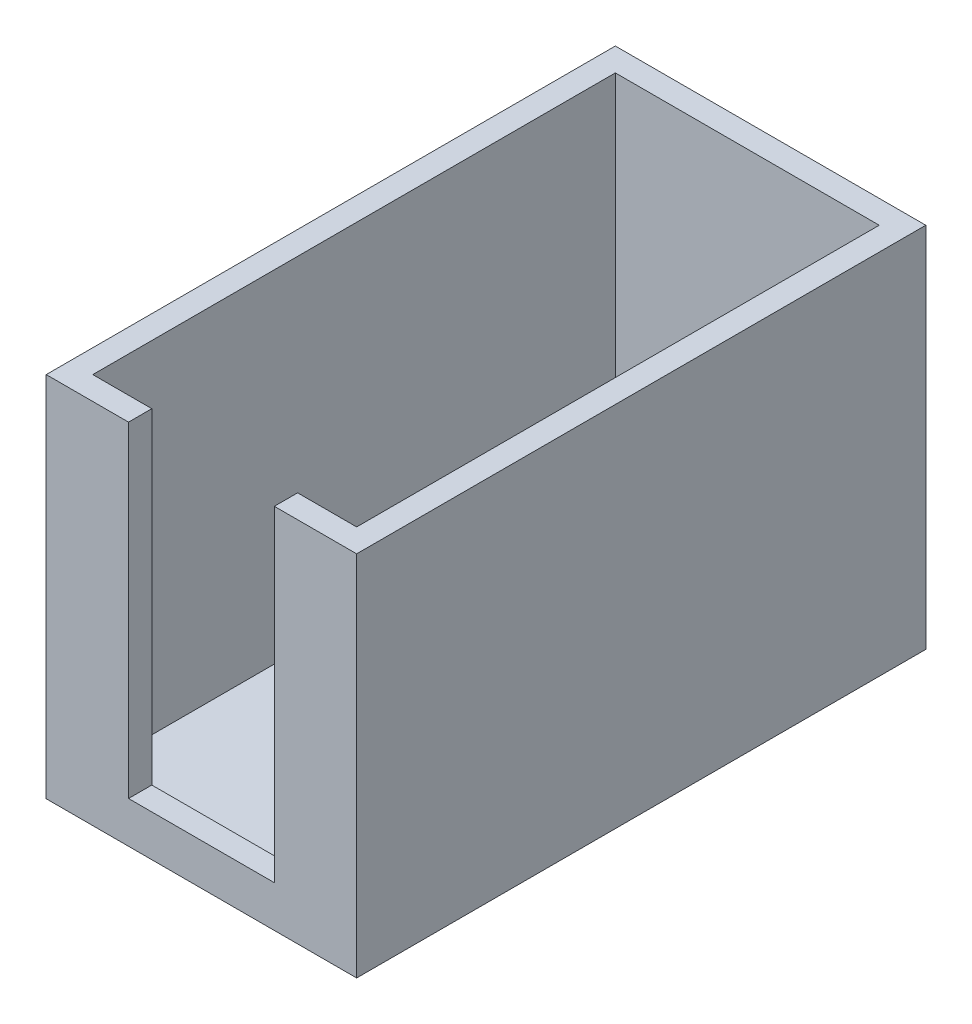
ISO-10303-21;
HEADER;
FILE_DESCRIPTION(('STEP AP214'),'2;1');
FILE_NAME('part.step','',(''),(''),'','','');
FILE_SCHEMA(('AUTOMOTIVE_DESIGN { 1 0 10303 214 1 1 1 1 }'));
ENDSEC;
DATA;
#1=APPLICATION_CONTEXT('core data for automotive mechanical design processes');
#2=APPLICATION_PROTOCOL_DEFINITION('international standard','automotive_design',2000,#1);
#3=PRODUCT_CONTEXT('',#1,'mechanical');
#4=PRODUCT('Part','Part','',(#3));
#5=PRODUCT_RELATED_PRODUCT_CATEGORY('part','',(#4));
#6=PRODUCT_DEFINITION_FORMATION('','',#4);
#7=PRODUCT_DEFINITION_CONTEXT('part definition',#1,'design');
#8=PRODUCT_DEFINITION('design','',#6,#7);
#9=PRODUCT_DEFINITION_SHAPE('','',#8);
#10=(LENGTH_UNIT() NAMED_UNIT(*) SI_UNIT(.MILLI.,.METRE.));
#11=(NAMED_UNIT(*) PLANE_ANGLE_UNIT() SI_UNIT($,.RADIAN.));
#12=(NAMED_UNIT(*) SI_UNIT($,.STERADIAN.) SOLID_ANGLE_UNIT());
#13=UNCERTAINTY_MEASURE_WITH_UNIT(LENGTH_MEASURE(1.E-05),#10,'distance_accuracy_value','');
#14=(GEOMETRIC_REPRESENTATION_CONTEXT(3) GLOBAL_UNCERTAINTY_ASSIGNED_CONTEXT((#13)) GLOBAL_UNIT_ASSIGNED_CONTEXT((#10,
#11,#12)) REPRESENTATION_CONTEXT('',''));
#15=CARTESIAN_POINT('',(0.,0.,0.));
#16=DIRECTION('',(0.,0.,1.));
#17=DIRECTION('',(1.,0.,0.));
#18=AXIS2_PLACEMENT_3D('',#15,#16,#17);
#19=CARTESIAN_POINT('',(0.,28.4,0.));
#20=DIRECTION('',(0.,1.,0.));
#21=DIRECTION('',(0.,0.,1.));
#22=AXIS2_PLACEMENT_3D('',#19,#20,#21);
#23=PLANE('',#22);
#24=DIRECTION('',(0.,0.,-1.));
#25=VECTOR('',#24,1.);
#26=CARTESIAN_POINT('',(5.63628838474872,28.4,34.2811228740046));
#27=LINE('',#26,#25);
#28=CARTESIAN_POINT('',(5.63628838474872,28.4,22.));
#29=VERTEX_POINT('',#28);
#30=CARTESIAN_POINT('',(5.63628838474872,28.4,20.2));
#31=VERTEX_POINT('',#30);
#32=EDGE_CURVE('E254',#29,#31,#27,.T.);
#33=ORIENTED_EDGE('',*,*,#32,.F.);
#34=DIRECTION('',(1.,0.,0.));
#35=VECTOR('',#34,1.);
#36=CARTESIAN_POINT('',(-10.2,28.4,22.));
#37=LINE('',#36,#35);
#38=CARTESIAN_POINT('',(12.,28.4,22.));
#39=VERTEX_POINT('',#38);
#40=EDGE_CURVE('E178',#29,#39,#37,.T.);
#41=ORIENTED_EDGE('',*,*,#40,.T.);
#42=DIRECTION('',(0.,0.,-1.));
#43=VECTOR('',#42,1.);
#44=CARTESIAN_POINT('',(12.,28.4,-20.2));
#45=LINE('',#44,#43);
#46=CARTESIAN_POINT('',(12.,28.4,-22.));
#47=VERTEX_POINT('',#46);
#48=EDGE_CURVE('E213',#39,#47,#45,.T.);
#49=ORIENTED_EDGE('',*,*,#48,.T.);
#50=DIRECTION('',(-1.,0.,0.));
#51=VECTOR('',#50,1.);
#52=CARTESIAN_POINT('',(-10.2,28.4,-22.));
#53=LINE('',#52,#51);
#54=CARTESIAN_POINT('',(-12.,28.4,-22.));
#55=VERTEX_POINT('',#54);
#56=EDGE_CURVE('E216',#47,#55,#53,.T.);
#57=ORIENTED_EDGE('',*,*,#56,.T.);
#58=DIRECTION('',(0.,0.,1.));
#59=VECTOR('',#58,1.);
#60=CARTESIAN_POINT('',(-12.,28.4,-20.2));
#61=LINE('',#60,#59);
#62=CARTESIAN_POINT('',(-12.,28.4,22.));
#63=VERTEX_POINT('',#62);
#64=EDGE_CURVE('E219',#55,#63,#61,.T.);
#65=ORIENTED_EDGE('',*,*,#64,.T.);
#66=CARTESIAN_POINT('',(-5.63628838474872,28.4,22.));
#67=VERTEX_POINT('',#66);
#68=EDGE_CURVE('E221',#63,#67,#37,.T.);
#69=ORIENTED_EDGE('',*,*,#68,.T.);
#70=DIRECTION('',(0.,0.,1.));
#71=VECTOR('',#70,1.);
#72=CARTESIAN_POINT('',(-5.63628838474872,28.4,34.2811228740046));
#73=LINE('',#72,#71);
#74=CARTESIAN_POINT('',(-5.63628838474872,28.4,20.2));
#75=VERTEX_POINT('',#74);
#76=EDGE_CURVE('E248',#75,#67,#73,.T.);
#77=ORIENTED_EDGE('',*,*,#76,.F.);
#78=DIRECTION('',(1.,0.,0.));
#79=VECTOR('',#78,1.);
#80=CARTESIAN_POINT('',(-10.2,28.4,20.2));
#81=LINE('',#80,#79);
#82=CARTESIAN_POINT('',(-10.2,28.4,20.2));
#83=VERTEX_POINT('',#82);
#84=EDGE_CURVE('E200',#83,#75,#81,.T.);
#85=ORIENTED_EDGE('',*,*,#84,.F.);
#86=DIRECTION('',(0.,0.,1.));
#87=VECTOR('',#86,1.);
#88=CARTESIAN_POINT('',(-10.2,28.4,-20.2));
#89=LINE('',#88,#87);
#90=CARTESIAN_POINT('',(-10.2,28.4,-20.2));
#91=VERTEX_POINT('',#90);
#92=EDGE_CURVE('E196',#91,#83,#89,.T.);
#93=ORIENTED_EDGE('',*,*,#92,.F.);
#94=DIRECTION('',(-1.,0.,0.));
#95=VECTOR('',#94,1.);
#96=CARTESIAN_POINT('',(-10.2,28.4,-20.2));
#97=LINE('',#96,#95);
#98=CARTESIAN_POINT('',(10.2,28.4,-20.2));
#99=VERTEX_POINT('',#98);
#100=EDGE_CURVE('E194',#99,#91,#97,.T.);
#101=ORIENTED_EDGE('',*,*,#100,.F.);
#102=DIRECTION('',(0.,0.,-1.));
#103=VECTOR('',#102,1.);
#104=CARTESIAN_POINT('',(10.2,28.4,-20.2));
#105=LINE('',#104,#103);
#106=CARTESIAN_POINT('',(10.2,28.4,20.2));
#107=VERTEX_POINT('',#106);
#108=EDGE_CURVE('E192',#107,#99,#105,.T.);
#109=ORIENTED_EDGE('',*,*,#108,.F.);
#110=EDGE_CURVE('E199',#31,#107,#81,.T.);
#111=ORIENTED_EDGE('',*,*,#110,.F.);
#112=EDGE_LOOP('',(#33,#41,#49,#57,#65,#69,#77,#85,#93,#101,#109,#111));
#113=FACE_BOUND('',#112,.T.);
#114=ADVANCED_FACE('F70',(#113),#23,.T.);
#115=CARTESIAN_POINT('',(0.,0.,0.));
#116=DIRECTION('',(0.,1.,0.));
#117=DIRECTION('',(0.,0.,1.));
#118=AXIS2_PLACEMENT_3D('',#115,#116,#117);
#119=PLANE('',#118);
#120=DIRECTION('',(0.,0.,-1.));
#121=VECTOR('',#120,1.);
#122=CARTESIAN_POINT('',(12.,0.,-20.2));
#123=LINE('',#122,#121);
#124=CARTESIAN_POINT('',(12.,0.,22.));
#125=VERTEX_POINT('',#124);
#126=CARTESIAN_POINT('',(12.,0.,-22.));
#127=VERTEX_POINT('',#126);
#128=EDGE_CURVE('E212',#125,#127,#123,.T.);
#129=ORIENTED_EDGE('',*,*,#128,.F.);
#130=DIRECTION('',(1.,0.,0.));
#131=VECTOR('',#130,1.);
#132=CARTESIAN_POINT('',(-10.2,0.,22.));
#133=LINE('',#132,#131);
#134=CARTESIAN_POINT('',(-12.,0.,22.));
#135=VERTEX_POINT('',#134);
#136=EDGE_CURVE('E217',#135,#125,#133,.T.);
#137=ORIENTED_EDGE('',*,*,#136,.F.);
#138=DIRECTION('',(0.,0.,1.));
#139=VECTOR('',#138,1.);
#140=CARTESIAN_POINT('',(-12.,0.,-20.2));
#141=LINE('',#140,#139);
#142=CARTESIAN_POINT('',(-12.,0.,-22.));
#143=VERTEX_POINT('',#142);
#144=EDGE_CURVE('E229',#143,#135,#141,.T.);
#145=ORIENTED_EDGE('',*,*,#144,.F.);
#146=DIRECTION('',(-1.,0.,0.));
#147=VECTOR('',#146,1.);
#148=CARTESIAN_POINT('',(-10.2,0.,-22.));
#149=LINE('',#148,#147);
#150=EDGE_CURVE('E227',#127,#143,#149,.T.);
#151=ORIENTED_EDGE('',*,*,#150,.F.);
#152=EDGE_LOOP('',(#129,#137,#145,#151));
#153=FACE_BOUND('',#152,.T.);
#154=ADVANCED_FACE('F279',(#153),#119,.F.);
#155=CARTESIAN_POINT('',(12.,28.4,-20.2));
#156=DIRECTION('',(-1.,0.,0.));
#157=DIRECTION('',(0.,0.,1.));
#158=AXIS2_PLACEMENT_3D('',#155,#156,#157);
#159=PLANE('',#158);
#160=ORIENTED_EDGE('',*,*,#128,.T.);
#161=DIRECTION('',(0.,-1.,0.));
#162=VECTOR('',#161,1.);
#163=CARTESIAN_POINT('',(12.,28.4,-22.));
#164=LINE('',#163,#162);
#165=EDGE_CURVE('E240',#47,#127,#164,.T.);
#166=ORIENTED_EDGE('',*,*,#165,.F.);
#167=ORIENTED_EDGE('',*,*,#48,.F.);
#168=DIRECTION('',(0.,-1.,0.));
#169=VECTOR('',#168,1.);
#170=CARTESIAN_POINT('',(12.,28.4,22.));
#171=LINE('',#170,#169);
#172=EDGE_CURVE('E224',#39,#125,#171,.T.);
#173=ORIENTED_EDGE('',*,*,#172,.T.);
#174=EDGE_LOOP('',(#160,#166,#167,#173));
#175=FACE_BOUND('',#174,.T.);
#176=ADVANCED_FACE('F72',(#175),#159,.F.);
#177=CARTESIAN_POINT('',(-10.2,28.4,-22.));
#178=DIRECTION('',(0.,0.,1.));
#179=DIRECTION('',(1.,0.,0.));
#180=AXIS2_PLACEMENT_3D('',#177,#178,#179);
#181=PLANE('',#180);
#182=ORIENTED_EDGE('',*,*,#150,.T.);
#183=DIRECTION('',(0.,-1.,0.));
#184=VECTOR('',#183,1.);
#185=CARTESIAN_POINT('',(-12.,28.4,-22.));
#186=LINE('',#185,#184);
#187=EDGE_CURVE('E237',#55,#143,#186,.T.);
#188=ORIENTED_EDGE('',*,*,#187,.F.);
#189=ORIENTED_EDGE('',*,*,#56,.F.);
#190=ORIENTED_EDGE('',*,*,#165,.T.);
#191=EDGE_LOOP('',(#182,#188,#189,#190));
#192=FACE_BOUND('',#191,.T.);
#193=ADVANCED_FACE('F293',(#192),#181,.F.);
#194=CARTESIAN_POINT('',(-12.,28.4,-20.2));
#195=DIRECTION('',(1.,0.,0.));
#196=DIRECTION('',(0.,0.,-1.));
#197=AXIS2_PLACEMENT_3D('',#194,#195,#196);
#198=PLANE('',#197);
#199=ORIENTED_EDGE('',*,*,#144,.T.);
#200=DIRECTION('',(0.,-1.,0.));
#201=VECTOR('',#200,1.);
#202=CARTESIAN_POINT('',(-12.,28.4,22.));
#203=LINE('',#202,#201);
#204=EDGE_CURVE('E234',#63,#135,#203,.T.);
#205=ORIENTED_EDGE('',*,*,#204,.F.);
#206=ORIENTED_EDGE('',*,*,#64,.F.);
#207=ORIENTED_EDGE('',*,*,#187,.T.);
#208=EDGE_LOOP('',(#199,#205,#206,#207));
#209=FACE_BOUND('',#208,.T.);
#210=ADVANCED_FACE('F291',(#209),#198,.F.);
#211=CARTESIAN_POINT('',(-10.2,28.4,22.));
#212=DIRECTION('',(0.,0.,-1.));
#213=DIRECTION('',(-1.,0.,0.));
#214=AXIS2_PLACEMENT_3D('',#211,#212,#213);
#215=PLANE('',#214);
#216=ORIENTED_EDGE('',*,*,#40,.F.);
#217=DIRECTION('',(0.,-1.,0.));
#218=VECTOR('',#217,1.);
#219=CARTESIAN_POINT('',(5.63628838474872,28.4,22.));
#220=LINE('',#219,#218);
#221=CARTESIAN_POINT('',(5.63628838474872,3.2,22.));
#222=VERTEX_POINT('',#221);
#223=EDGE_CURVE('E170',#29,#222,#220,.T.);
#224=ORIENTED_EDGE('',*,*,#223,.T.);
#225=DIRECTION('',(1.,0.,0.));
#226=VECTOR('',#225,1.);
#227=CARTESIAN_POINT('',(-10.2,3.2,22.));
#228=LINE('',#227,#226);
#229=CARTESIAN_POINT('',(-5.63628838474872,3.2,22.));
#230=VERTEX_POINT('',#229);
#231=EDGE_CURVE('E159',#230,#222,#228,.T.);
#232=ORIENTED_EDGE('',*,*,#231,.F.);
#233=DIRECTION('',(0.,1.,0.));
#234=VECTOR('',#233,1.);
#235=CARTESIAN_POINT('',(-5.63628838474872,28.4,22.));
#236=LINE('',#235,#234);
#237=EDGE_CURVE('E166',#230,#67,#236,.T.);
#238=ORIENTED_EDGE('',*,*,#237,.T.);
#239=ORIENTED_EDGE('',*,*,#68,.F.);
#240=ORIENTED_EDGE('',*,*,#204,.T.);
#241=ORIENTED_EDGE('',*,*,#136,.T.);
#242=ORIENTED_EDGE('',*,*,#172,.F.);
#243=EDGE_LOOP('',(#216,#224,#232,#238,#239,#240,#241,#242));
#244=FACE_BOUND('',#243,.T.);
#245=ADVANCED_FACE('F176',(#244),#215,.F.);
#246=CARTESIAN_POINT('',(10.2,28.4,-20.2));
#247=DIRECTION('',(-1.,0.,0.));
#248=DIRECTION('',(0.,0.,1.));
#249=AXIS2_PLACEMENT_3D('',#246,#247,#248);
#250=PLANE('',#249);
#251=DIRECTION('',(0.,0.,-1.));
#252=VECTOR('',#251,1.);
#253=CARTESIAN_POINT('',(10.2,2.,-20.2));
#254=LINE('',#253,#252);
#255=CARTESIAN_POINT('',(10.2,2.,20.2));
#256=VERTEX_POINT('',#255);
#257=CARTESIAN_POINT('',(10.2,2.,-20.2));
#258=VERTEX_POINT('',#257);
#259=EDGE_CURVE('E179',#256,#258,#254,.T.);
#260=ORIENTED_EDGE('',*,*,#259,.F.);
#261=DIRECTION('',(0.,-1.,0.));
#262=VECTOR('',#261,1.);
#263=CARTESIAN_POINT('',(10.2,28.4,20.2));
#264=LINE('',#263,#262);
#265=EDGE_CURVE('E203',#107,#256,#264,.T.);
#266=ORIENTED_EDGE('',*,*,#265,.F.);
#267=ORIENTED_EDGE('',*,*,#108,.T.);
#268=DIRECTION('',(0.,-1.,0.));
#269=VECTOR('',#268,1.);
#270=CARTESIAN_POINT('',(10.2,28.4,-20.2));
#271=LINE('',#270,#269);
#272=EDGE_CURVE('E210',#99,#258,#271,.T.);
#273=ORIENTED_EDGE('',*,*,#272,.T.);
#274=EDGE_LOOP('',(#260,#266,#267,#273));
#275=FACE_BOUND('',#274,.T.);
#276=ADVANCED_FACE('F266',(#275),#250,.T.);
#277=CARTESIAN_POINT('',(-10.2,28.4,-20.2));
#278=DIRECTION('',(0.,0.,1.));
#279=DIRECTION('',(1.,0.,0.));
#280=AXIS2_PLACEMENT_3D('',#277,#278,#279);
#281=PLANE('',#280);
#282=DIRECTION('',(-1.,0.,0.));
#283=VECTOR('',#282,1.);
#284=CARTESIAN_POINT('',(-10.2,2.,-20.2));
#285=LINE('',#284,#283);
#286=CARTESIAN_POINT('',(-10.2,2.,-20.2));
#287=VERTEX_POINT('',#286);
#288=EDGE_CURVE('E92',#258,#287,#285,.T.);
#289=ORIENTED_EDGE('',*,*,#288,.F.);
#290=ORIENTED_EDGE('',*,*,#272,.F.);
#291=ORIENTED_EDGE('',*,*,#100,.T.);
#292=DIRECTION('',(0.,-1.,0.));
#293=VECTOR('',#292,1.);
#294=CARTESIAN_POINT('',(-10.2,28.4,-20.2));
#295=LINE('',#294,#293);
#296=EDGE_CURVE('E208',#91,#287,#295,.T.);
#297=ORIENTED_EDGE('',*,*,#296,.T.);
#298=EDGE_LOOP('',(#289,#290,#291,#297));
#299=FACE_BOUND('',#298,.T.);
#300=ADVANCED_FACE('F263',(#299),#281,.T.);
#301=CARTESIAN_POINT('',(-10.2,28.4,-20.2));
#302=DIRECTION('',(1.,0.,0.));
#303=DIRECTION('',(0.,0.,-1.));
#304=AXIS2_PLACEMENT_3D('',#301,#302,#303);
#305=PLANE('',#304);
#306=DIRECTION('',(0.,0.,1.));
#307=VECTOR('',#306,1.);
#308=CARTESIAN_POINT('',(-10.2,2.,-20.2));
#309=LINE('',#308,#307);
#310=CARTESIAN_POINT('',(-10.2,2.,20.2));
#311=VERTEX_POINT('',#310);
#312=EDGE_CURVE('E186',#287,#311,#309,.T.);
#313=ORIENTED_EDGE('',*,*,#312,.F.);
#314=ORIENTED_EDGE('',*,*,#296,.F.);
#315=ORIENTED_EDGE('',*,*,#92,.T.);
#316=DIRECTION('',(0.,-1.,0.));
#317=VECTOR('',#316,1.);
#318=CARTESIAN_POINT('',(-10.2,28.4,20.2));
#319=LINE('',#318,#317);
#320=EDGE_CURVE('E205',#83,#311,#319,.T.);
#321=ORIENTED_EDGE('',*,*,#320,.T.);
#322=EDGE_LOOP('',(#313,#314,#315,#321));
#323=FACE_BOUND('',#322,.T.);
#324=ADVANCED_FACE('F259',(#323),#305,.T.);
#325=CARTESIAN_POINT('',(-10.2,28.4,20.2));
#326=DIRECTION('',(0.,0.,-1.));
#327=DIRECTION('',(-1.,0.,0.));
#328=AXIS2_PLACEMENT_3D('',#325,#326,#327);
#329=PLANE('',#328);
#330=DIRECTION('',(0.,-1.,0.));
#331=VECTOR('',#330,1.);
#332=CARTESIAN_POINT('',(5.63628838474872,28.4,20.2));
#333=LINE('',#332,#331);
#334=CARTESIAN_POINT('',(5.63628838474872,3.2,20.2));
#335=VERTEX_POINT('',#334);
#336=EDGE_CURVE('E14',#31,#335,#333,.T.);
#337=ORIENTED_EDGE('',*,*,#336,.F.);
#338=ORIENTED_EDGE('',*,*,#110,.T.);
#339=ORIENTED_EDGE('',*,*,#265,.T.);
#340=DIRECTION('',(1.,0.,0.));
#341=VECTOR('',#340,1.);
#342=CARTESIAN_POINT('',(-10.2,2.,20.2));
#343=LINE('',#342,#341);
#344=EDGE_CURVE('E189',#311,#256,#343,.T.);
#345=ORIENTED_EDGE('',*,*,#344,.F.);
#346=ORIENTED_EDGE('',*,*,#320,.F.);
#347=ORIENTED_EDGE('',*,*,#84,.T.);
#348=DIRECTION('',(0.,1.,0.));
#349=VECTOR('',#348,1.);
#350=CARTESIAN_POINT('',(-5.63628838474872,28.4,20.2));
#351=LINE('',#350,#349);
#352=CARTESIAN_POINT('',(-5.63628838474872,3.2,20.2));
#353=VERTEX_POINT('',#352);
#354=EDGE_CURVE('E78',#353,#75,#351,.T.);
#355=ORIENTED_EDGE('',*,*,#354,.F.);
#356=DIRECTION('',(1.,0.,0.));
#357=VECTOR('',#356,1.);
#358=CARTESIAN_POINT('',(-10.2,3.2,20.2));
#359=LINE('',#358,#357);
#360=EDGE_CURVE('E243',#353,#335,#359,.T.);
#361=ORIENTED_EDGE('',*,*,#360,.T.);
#362=EDGE_LOOP('',(#337,#338,#339,#345,#346,#347,#355,#361));
#363=FACE_BOUND('',#362,.T.);
#364=ADVANCED_FACE('F256',(#363),#329,.T.);
#365=CARTESIAN_POINT('',(0.,2.,0.));
#366=DIRECTION('',(0.,1.,0.));
#367=DIRECTION('',(0.,0.,1.));
#368=AXIS2_PLACEMENT_3D('',#365,#366,#367);
#369=PLANE('',#368);
#370=ORIENTED_EDGE('',*,*,#259,.T.);
#371=ORIENTED_EDGE('',*,*,#288,.T.);
#372=ORIENTED_EDGE('',*,*,#312,.T.);
#373=ORIENTED_EDGE('',*,*,#344,.T.);
#374=EDGE_LOOP('',(#370,#371,#372,#373));
#375=FACE_BOUND('',#374,.T.);
#376=ADVANCED_FACE('F269',(#375),#369,.T.);
#377=CARTESIAN_POINT('',(5.63628838474872,-20.3891238747746,34.2811228740046));
#378=DIRECTION('',(1.,0.,0.));
#379=DIRECTION('',(0.,0.,-1.));
#380=AXIS2_PLACEMENT_3D('',#377,#378,#379);
#381=PLANE('',#380);
#382=ORIENTED_EDGE('',*,*,#32,.T.);
#383=ORIENTED_EDGE('',*,*,#336,.T.);
#384=DIRECTION('',(0.,0.,1.));
#385=VECTOR('',#384,1.);
#386=CARTESIAN_POINT('',(5.63628838474872,3.2,34.2811228740046));
#387=LINE('',#386,#385);
#388=EDGE_CURVE('E85',#335,#222,#387,.T.);
#389=ORIENTED_EDGE('',*,*,#388,.T.);
#390=ORIENTED_EDGE('',*,*,#223,.F.);
#391=EDGE_LOOP('',(#382,#383,#389,#390));
#392=FACE_BOUND('',#391,.T.);
#393=ADVANCED_FACE('F169',(#392),#381,.F.);
#394=CARTESIAN_POINT('',(-5.63628838474872,-20.3891238747746,34.2811228740046));
#395=DIRECTION('',(-1.,0.,0.));
#396=DIRECTION('',(0.,0.,1.));
#397=AXIS2_PLACEMENT_3D('',#394,#395,#396);
#398=PLANE('',#397);
#399=DIRECTION('',(0.,0.,-1.));
#400=VECTOR('',#399,1.);
#401=CARTESIAN_POINT('',(-5.63628838474872,3.2,34.2811228740046));
#402=LINE('',#401,#400);
#403=EDGE_CURVE('E162',#230,#353,#402,.T.);
#404=ORIENTED_EDGE('',*,*,#403,.T.);
#405=ORIENTED_EDGE('',*,*,#354,.T.);
#406=ORIENTED_EDGE('',*,*,#76,.T.);
#407=ORIENTED_EDGE('',*,*,#237,.F.);
#408=EDGE_LOOP('',(#404,#405,#406,#407));
#409=FACE_BOUND('',#408,.T.);
#410=ADVANCED_FACE('F247',(#409),#398,.F.);
#411=CARTESIAN_POINT('',(0.,3.2,0.));
#412=DIRECTION('',(0.,1.,0.));
#413=DIRECTION('',(0.,0.,1.));
#414=AXIS2_PLACEMENT_3D('',#411,#412,#413);
#415=PLANE('',#414);
#416=ORIENTED_EDGE('',*,*,#231,.T.);
#417=ORIENTED_EDGE('',*,*,#388,.F.);
#418=ORIENTED_EDGE('',*,*,#360,.F.);
#419=ORIENTED_EDGE('',*,*,#403,.F.);
#420=EDGE_LOOP('',(#416,#417,#418,#419));
#421=FACE_BOUND('',#420,.T.);
#422=ADVANCED_FACE('F160',(#421),#415,.T.);
#423=CLOSED_SHELL('',(#114,#154,#176,#193,#210,#245,#276,#300,#324,#364,#376,#393,#410,#422));
#424=MANIFOLD_SOLID_BREP('B2',#423);
#425=ADVANCED_BREP_SHAPE_REPRESENTATION('',(#18,#424),#14);
#426=SHAPE_DEFINITION_REPRESENTATION(#9,#425);
ENDSEC;
END-ISO-10303-21;
